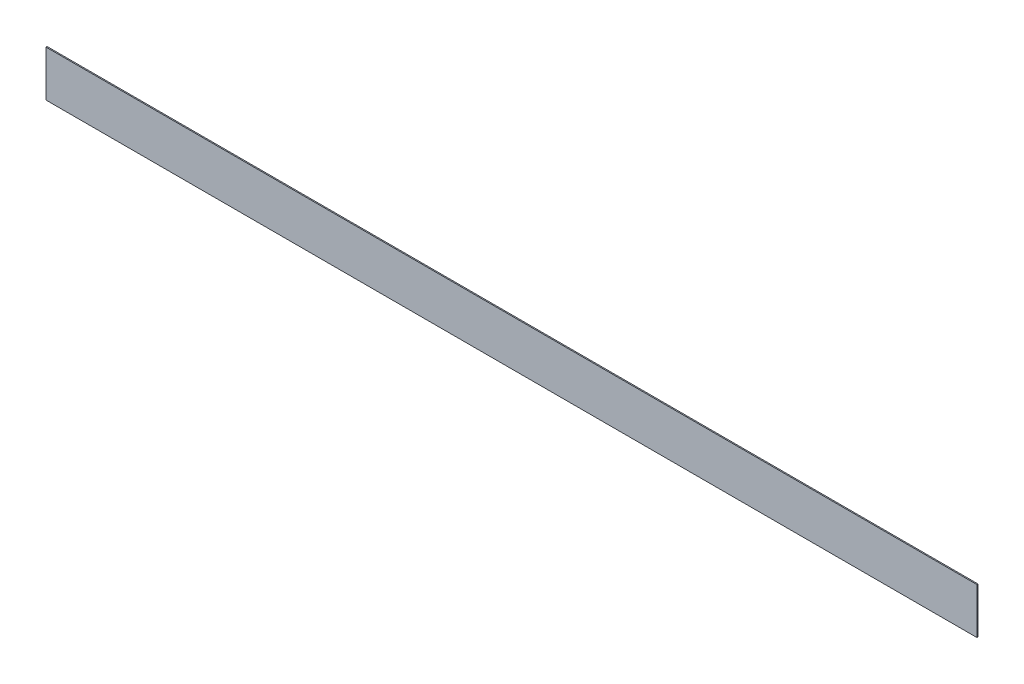
ISO-10303-21;
HEADER;
FILE_DESCRIPTION(('STEP AP214'),'2;1');
FILE_NAME('part.step','',(''),(''),'','','');
FILE_SCHEMA(('AUTOMOTIVE_DESIGN { 1 0 10303 214 1 1 1 1 }'));
ENDSEC;
DATA;
#1=APPLICATION_CONTEXT('core data for automotive mechanical design processes');
#2=APPLICATION_PROTOCOL_DEFINITION('international standard','automotive_design',2000,#1);
#3=PRODUCT_CONTEXT('',#1,'mechanical');
#4=PRODUCT('Part','Part','',(#3));
#5=PRODUCT_RELATED_PRODUCT_CATEGORY('part','',(#4));
#6=PRODUCT_DEFINITION_FORMATION('','',#4);
#7=PRODUCT_DEFINITION_CONTEXT('part definition',#1,'design');
#8=PRODUCT_DEFINITION('design','',#6,#7);
#9=PRODUCT_DEFINITION_SHAPE('','',#8);
#10=(LENGTH_UNIT() NAMED_UNIT(*) SI_UNIT(.MILLI.,.METRE.));
#11=(NAMED_UNIT(*) PLANE_ANGLE_UNIT() SI_UNIT($,.RADIAN.));
#12=(NAMED_UNIT(*) SI_UNIT($,.STERADIAN.) SOLID_ANGLE_UNIT());
#13=UNCERTAINTY_MEASURE_WITH_UNIT(LENGTH_MEASURE(1.E-05),#10,'distance_accuracy_value','');
#14=(GEOMETRIC_REPRESENTATION_CONTEXT(3) GLOBAL_UNCERTAINTY_ASSIGNED_CONTEXT((#13)) GLOBAL_UNIT_ASSIGNED_CONTEXT((#10,
#11,#12)) REPRESENTATION_CONTEXT('',''));
#15=CARTESIAN_POINT('',(0.,0.,0.));
#16=DIRECTION('',(0.,0.,1.));
#17=DIRECTION('',(1.,0.,0.));
#18=AXIS2_PLACEMENT_3D('',#15,#16,#17);
#19=CARTESIAN_POINT('',(66.,120.,40.));
#20=DIRECTION('',(1.,0.,0.));
#21=DIRECTION('',(0.,0.,-1.));
#22=AXIS2_PLACEMENT_3D('',#19,#20,#21);
#23=PLANE('',#22);
#24=DIRECTION('',(0.,-1.,0.));
#25=VECTOR('',#24,1.);
#26=CARTESIAN_POINT('',(66.,120.,38.5));
#27=LINE('',#26,#25);
#28=CARTESIAN_POINT('',(66.,182.5,38.5));
#29=VERTEX_POINT('',#28);
#30=CARTESIAN_POINT('',(66.,120.,38.5));
#31=VERTEX_POINT('',#30);
#32=EDGE_CURVE('E102',#29,#31,#27,.T.);
#33=ORIENTED_EDGE('',*,*,#32,.T.);
#34=DIRECTION('',(0.,0.,-1.));
#35=VECTOR('',#34,1.);
#36=CARTESIAN_POINT('',(66.,120.,40.));
#37=LINE('',#36,#35);
#38=CARTESIAN_POINT('',(66.,120.,40.));
#39=VERTEX_POINT('',#38);
#40=EDGE_CURVE('E11',#39,#31,#37,.T.);
#41=ORIENTED_EDGE('',*,*,#40,.F.);
#42=DIRECTION('',(0.,-1.,0.));
#43=VECTOR('',#42,1.);
#44=CARTESIAN_POINT('',(66.,120.,40.));
#45=LINE('',#44,#43);
#46=CARTESIAN_POINT('',(66.,182.5,40.));
#47=VERTEX_POINT('',#46);
#48=EDGE_CURVE('E90',#47,#39,#45,.T.);
#49=ORIENTED_EDGE('',*,*,#48,.F.);
#50=DIRECTION('',(0.,0.,-1.));
#51=VECTOR('',#50,1.);
#52=CARTESIAN_POINT('',(66.,182.5,40.));
#53=LINE('',#52,#51);
#54=EDGE_CURVE('E98',#47,#29,#53,.T.);
#55=ORIENTED_EDGE('',*,*,#54,.T.);
#56=EDGE_LOOP('',(#33,#41,#49,#55));
#57=FACE_BOUND('',#56,.T.);
#58=ADVANCED_FACE('F39',(#57),#23,.F.);
#59=CARTESIAN_POINT('',(66.,120.,40.));
#60=DIRECTION('',(0.,1.,0.));
#61=DIRECTION('',(0.,0.,1.));
#62=AXIS2_PLACEMENT_3D('',#59,#60,#61);
#63=PLANE('',#62);
#64=DIRECTION('',(1.,0.,0.));
#65=VECTOR('',#64,1.);
#66=CARTESIAN_POINT('',(66.,120.,38.5));
#67=LINE('',#66,#65);
#68=CARTESIAN_POINT('',(1334.,120.,38.5));
#69=VERTEX_POINT('',#68);
#70=EDGE_CURVE('E94',#31,#69,#67,.T.);
#71=ORIENTED_EDGE('',*,*,#70,.T.);
#72=DIRECTION('',(0.,0.,-1.));
#73=VECTOR('',#72,1.);
#74=CARTESIAN_POINT('',(1334.,120.,40.));
#75=LINE('',#74,#73);
#76=CARTESIAN_POINT('',(1334.,120.,40.));
#77=VERTEX_POINT('',#76);
#78=EDGE_CURVE('E47',#77,#69,#75,.T.);
#79=ORIENTED_EDGE('',*,*,#78,.F.);
#80=DIRECTION('',(1.,0.,0.));
#81=VECTOR('',#80,1.);
#82=CARTESIAN_POINT('',(66.,120.,40.));
#83=LINE('',#82,#81);
#84=EDGE_CURVE('E85',#39,#77,#83,.T.);
#85=ORIENTED_EDGE('',*,*,#84,.F.);
#86=ORIENTED_EDGE('',*,*,#40,.T.);
#87=EDGE_LOOP('',(#71,#79,#85,#86));
#88=FACE_BOUND('',#87,.T.);
#89=ADVANCED_FACE('F93',(#88),#63,.F.);
#90=CARTESIAN_POINT('',(1334.,120.,40.));
#91=DIRECTION('',(-1.,0.,0.));
#92=DIRECTION('',(0.,0.,1.));
#93=AXIS2_PLACEMENT_3D('',#90,#91,#92);
#94=PLANE('',#93);
#95=DIRECTION('',(0.,1.,0.));
#96=VECTOR('',#95,1.);
#97=CARTESIAN_POINT('',(1334.,120.,38.5));
#98=LINE('',#97,#96);
#99=CARTESIAN_POINT('',(1334.,182.5,38.5));
#100=VERTEX_POINT('',#99);
#101=EDGE_CURVE('E72',#69,#100,#98,.T.);
#102=ORIENTED_EDGE('',*,*,#101,.T.);
#103=DIRECTION('',(0.,0.,-1.));
#104=VECTOR('',#103,1.);
#105=CARTESIAN_POINT('',(1334.,182.5,40.));
#106=LINE('',#105,#104);
#107=CARTESIAN_POINT('',(1334.,182.5,40.));
#108=VERTEX_POINT('',#107);
#109=EDGE_CURVE('E95',#108,#100,#106,.T.);
#110=ORIENTED_EDGE('',*,*,#109,.F.);
#111=DIRECTION('',(0.,1.,0.));
#112=VECTOR('',#111,1.);
#113=CARTESIAN_POINT('',(1334.,120.,40.));
#114=LINE('',#113,#112);
#115=EDGE_CURVE('E88',#77,#108,#114,.T.);
#116=ORIENTED_EDGE('',*,*,#115,.F.);
#117=ORIENTED_EDGE('',*,*,#78,.T.);
#118=EDGE_LOOP('',(#102,#110,#116,#117));
#119=FACE_BOUND('',#118,.T.);
#120=ADVANCED_FACE('F96',(#119),#94,.F.);
#121=CARTESIAN_POINT('',(66.,182.5,40.));
#122=DIRECTION('',(0.,-1.,0.));
#123=DIRECTION('',(0.,0.,-1.));
#124=AXIS2_PLACEMENT_3D('',#121,#122,#123);
#125=PLANE('',#124);
#126=DIRECTION('',(-1.,0.,0.));
#127=VECTOR('',#126,1.);
#128=CARTESIAN_POINT('',(66.,182.5,38.5));
#129=LINE('',#128,#127);
#130=EDGE_CURVE('E78',#100,#29,#129,.T.);
#131=ORIENTED_EDGE('',*,*,#130,.T.);
#132=ORIENTED_EDGE('',*,*,#54,.F.);
#133=DIRECTION('',(-1.,0.,0.));
#134=VECTOR('',#133,1.);
#135=CARTESIAN_POINT('',(66.,182.5,40.));
#136=LINE('',#135,#134);
#137=EDGE_CURVE('E55',#108,#47,#136,.T.);
#138=ORIENTED_EDGE('',*,*,#137,.F.);
#139=ORIENTED_EDGE('',*,*,#109,.T.);
#140=EDGE_LOOP('',(#131,#132,#138,#139));
#141=FACE_BOUND('',#140,.T.);
#142=ADVANCED_FACE('F109',(#141),#125,.F.);
#143=CARTESIAN_POINT('',(0.,0.,40.));
#144=DIRECTION('',(0.,0.,-1.));
#145=DIRECTION('',(-1.,0.,0.));
#146=AXIS2_PLACEMENT_3D('',#143,#144,#145);
#147=PLANE('',#146);
#148=ORIENTED_EDGE('',*,*,#48,.T.);
#149=ORIENTED_EDGE('',*,*,#84,.T.);
#150=ORIENTED_EDGE('',*,*,#115,.T.);
#151=ORIENTED_EDGE('',*,*,#137,.T.);
#152=EDGE_LOOP('',(#148,#149,#150,#151));
#153=FACE_BOUND('',#152,.T.);
#154=ADVANCED_FACE('F86',(#153),#147,.F.);
#155=CARTESIAN_POINT('',(0.,0.,38.5));
#156=DIRECTION('',(0.,0.,-1.));
#157=DIRECTION('',(-1.,0.,0.));
#158=AXIS2_PLACEMENT_3D('',#155,#156,#157);
#159=PLANE('',#158);
#160=ORIENTED_EDGE('',*,*,#32,.F.);
#161=ORIENTED_EDGE('',*,*,#130,.F.);
#162=ORIENTED_EDGE('',*,*,#101,.F.);
#163=ORIENTED_EDGE('',*,*,#70,.F.);
#164=EDGE_LOOP('',(#160,#161,#162,#163));
#165=FACE_BOUND('',#164,.T.);
#166=ADVANCED_FACE('F112',(#165),#159,.T.);
#167=CLOSED_SHELL('',(#58,#89,#120,#142,#154,#166));
#168=MANIFOLD_SOLID_BREP('B2',#167);
#169=ADVANCED_BREP_SHAPE_REPRESENTATION('',(#18,#168),#14);
#170=SHAPE_DEFINITION_REPRESENTATION(#9,#169);
ENDSEC;
END-ISO-10303-21;
